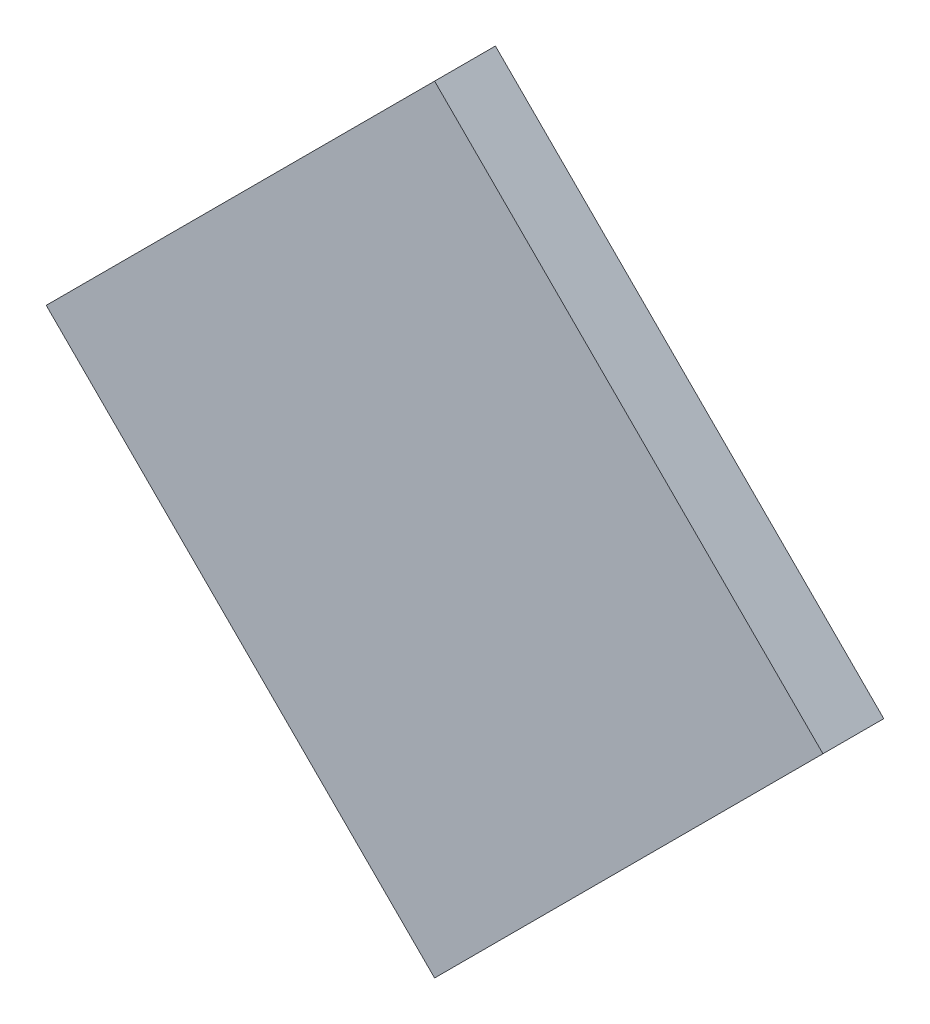
ISO-10303-21;
HEADER;
FILE_DESCRIPTION(('STEP AP214'),'2;1');
FILE_NAME('part.step','',(''),(''),'','','');
FILE_SCHEMA(('AUTOMOTIVE_DESIGN { 1 0 10303 214 1 1 1 1 }'));
ENDSEC;
DATA;
#1=APPLICATION_CONTEXT('core data for automotive mechanical design processes');
#2=APPLICATION_PROTOCOL_DEFINITION('international standard','automotive_design',2000,#1);
#3=PRODUCT_CONTEXT('',#1,'mechanical');
#4=PRODUCT('Part','Part','',(#3));
#5=PRODUCT_RELATED_PRODUCT_CATEGORY('part','',(#4));
#6=PRODUCT_DEFINITION_FORMATION('','',#4);
#7=PRODUCT_DEFINITION_CONTEXT('part definition',#1,'design');
#8=PRODUCT_DEFINITION('design','',#6,#7);
#9=PRODUCT_DEFINITION_SHAPE('','',#8);
#10=(LENGTH_UNIT() NAMED_UNIT(*) SI_UNIT(.MILLI.,.METRE.));
#11=(NAMED_UNIT(*) PLANE_ANGLE_UNIT() SI_UNIT($,.RADIAN.));
#12=(NAMED_UNIT(*) SI_UNIT($,.STERADIAN.) SOLID_ANGLE_UNIT());
#13=UNCERTAINTY_MEASURE_WITH_UNIT(LENGTH_MEASURE(1.E-05),#10,'distance_accuracy_value','');
#14=(GEOMETRIC_REPRESENTATION_CONTEXT(3) GLOBAL_UNCERTAINTY_ASSIGNED_CONTEXT((#13)) GLOBAL_UNIT_ASSIGNED_CONTEXT((#10,
#11,#12)) REPRESENTATION_CONTEXT('',''));
#15=CARTESIAN_POINT('',(0.,0.,0.));
#16=DIRECTION('',(0.,0.,1.));
#17=DIRECTION('',(1.,0.,0.));
#18=AXIS2_PLACEMENT_3D('',#15,#16,#17);
#19=CARTESIAN_POINT('',(-5.079999993995E-06,9.89949252,1.54999944));
#20=DIRECTION('',(0.,0.,-1.));
#21=DIRECTION('',(-1.,0.,0.));
#22=AXIS2_PLACEMENT_3D('',#19,#20,#21);
#23=PLANE('',#22);
#24=DIRECTION('',(-0.707107144043954,0.707106418328954,0.));
#25=VECTOR('',#24,1.);
#26=CARTESIAN_POINT('',(-9.89949252,-5.080000001101E-06,1.54999944));
#27=LINE('',#26,#25);
#28=CARTESIAN_POINT('',(-9.89949251999906,-5.08000094196808E-06,1.54999944));
#29=VERTEX_POINT('',#28);
#30=CARTESIAN_POINT('',(5.08000095827439E-06,-9.89949251999907,1.54999944));
#31=VERTEX_POINT('',#30);
#32=EDGE_CURVE('E55',#29,#31,#27,.F.);
#33=ORIENTED_EDGE('',*,*,#32,.T.);
#34=DIRECTION('',(-0.707106418328954,-0.707107144043954,0.));
#35=VECTOR('',#34,1.);
#36=CARTESIAN_POINT('',(5.080000022417E-06,-9.89949252,1.54999944));
#37=LINE('',#36,#35);
#38=CARTESIAN_POINT('',(9.89949251999906,5.08000093828179E-06,1.54999944));
#39=VERTEX_POINT('',#38);
#40=EDGE_CURVE('E57',#31,#39,#37,.F.);
#41=ORIENTED_EDGE('',*,*,#40,.T.);
#42=DIRECTION('',(0.707107144043954,-0.707106418328954,0.));
#43=VECTOR('',#42,1.);
#44=CARTESIAN_POINT('',(9.89949252,5.080000001101E-06,1.54999944));
#45=LINE('',#44,#43);
#46=CARTESIAN_POINT('',(-5.08000187482584E-06,9.89949251999812,1.54999944));
#47=VERTEX_POINT('',#46);
#48=EDGE_CURVE('E20',#39,#47,#45,.F.);
#49=ORIENTED_EDGE('',*,*,#48,.T.);
#50=DIRECTION('',(0.707106418328954,0.707107144043954,0.));
#51=VECTOR('',#50,1.);
#52=CARTESIAN_POINT('',(-5.079999993995E-06,9.89949252,1.54999944));
#53=LINE('',#52,#51);
#54=EDGE_CURVE('E80',#47,#29,#53,.F.);
#55=ORIENTED_EDGE('',*,*,#54,.T.);
#56=EDGE_LOOP('',(#33,#41,#49,#55));
#57=FACE_BOUND('',#56,.T.);
#58=ADVANCED_FACE('F17',(#57),#23,.F.);
#59=CARTESIAN_POINT('',(9.89949252,5.080000001101E-06,0.));
#60=DIRECTION('',(-0.707106418328954,-0.707107144043954,0.));
#61=DIRECTION('',(0.707107144043954,-0.707106418328954,0.));
#62=AXIS2_PLACEMENT_3D('',#59,#60,#61);
#63=PLANE('',#62);
#64=DIRECTION('',(0.,0.,1.));
#65=VECTOR('',#64,1.);
#66=CARTESIAN_POINT('',(-5.079999993995E-06,9.89949252,0.));
#67=LINE('',#66,#65);
#68=CARTESIAN_POINT('',(-5.08000187612688E-06,9.89949251999812,0.));
#69=VERTEX_POINT('',#68);
#70=EDGE_CURVE('E68',#69,#47,#67,.T.);
#71=ORIENTED_EDGE('',*,*,#70,.T.);
#72=ORIENTED_EDGE('',*,*,#48,.F.);
#73=DIRECTION('',(0.,0.,1.));
#74=VECTOR('',#73,1.);
#75=CARTESIAN_POINT('',(9.89949251999626,5.08000375099016E-06,0.));
#76=LINE('',#75,#74);
#77=CARTESIAN_POINT('',(9.89949251999906,5.08000093886122E-06,0.));
#78=VERTEX_POINT('',#77);
#79=EDGE_CURVE('E63',#39,#78,#76,.F.);
#80=ORIENTED_EDGE('',*,*,#79,.T.);
#81=DIRECTION('',(0.707107144043686,-0.707106418329223,0.));
#82=VECTOR('',#81,1.);
#83=CARTESIAN_POINT('',(-5.079999993995E-06,9.89949252,0.));
#84=LINE('',#83,#82);
#85=EDGE_CURVE('E83',#69,#78,#84,.T.);
#86=ORIENTED_EDGE('',*,*,#85,.F.);
#87=EDGE_LOOP('',(#71,#72,#80,#86));
#88=FACE_BOUND('',#87,.T.);
#89=ADVANCED_FACE('F65',(#88),#63,.F.);
#90=CARTESIAN_POINT('',(5.080000022417E-06,-9.89949252,0.));
#91=DIRECTION('',(-0.707107144043954,0.707106418328954,0.));
#92=DIRECTION('',(-0.707106418328954,-0.707107144043954,0.));
#93=AXIS2_PLACEMENT_3D('',#90,#91,#92);
#94=PLANE('',#93);
#95=ORIENTED_EDGE('',*,*,#79,.F.);
#96=ORIENTED_EDGE('',*,*,#40,.F.);
#97=DIRECTION('',(0.,0.,1.));
#98=VECTOR('',#97,1.);
#99=CARTESIAN_POINT('',(5.08000377180684E-06,-9.89949251999625,0.));
#100=LINE('',#99,#98);
#101=CARTESIAN_POINT('',(5.08000095945311E-06,-9.89949251999906,0.));
#102=VERTEX_POINT('',#101);
#103=EDGE_CURVE('E75',#31,#102,#100,.F.);
#104=ORIENTED_EDGE('',*,*,#103,.T.);
#105=DIRECTION('',(-0.707106418329222,-0.707107144043687,0.));
#106=VECTOR('',#105,1.);
#107=CARTESIAN_POINT('',(9.89949252,5.080000000518E-06,0.));
#108=LINE('',#107,#106);
#109=EDGE_CURVE('E72',#78,#102,#108,.T.);
#110=ORIENTED_EDGE('',*,*,#109,.F.);
#111=EDGE_LOOP('',(#95,#96,#104,#110));
#112=FACE_BOUND('',#111,.T.);
#113=ADVANCED_FACE('F70',(#112),#94,.F.);
#114=CARTESIAN_POINT('',(-9.89949252,-5.080000001101E-06,0.));
#115=DIRECTION('',(0.707106418328954,0.707107144043954,0.));
#116=DIRECTION('',(-0.707107144043954,0.707106418328954,0.));
#117=AXIS2_PLACEMENT_3D('',#114,#115,#116);
#118=PLANE('',#117);
#119=ORIENTED_EDGE('',*,*,#103,.F.);
#120=ORIENTED_EDGE('',*,*,#32,.F.);
#121=DIRECTION('',(0.,0.,1.));
#122=VECTOR('',#121,1.);
#123=CARTESIAN_POINT('',(-9.89949251999624,-5.08000376486795E-06,0.));
#124=LINE('',#123,#122);
#125=CARTESIAN_POINT('',(-9.89949251999906,-5.08000094233067E-06,0.));
#126=VERTEX_POINT('',#125);
#127=EDGE_CURVE('E35',#29,#126,#124,.F.);
#128=ORIENTED_EDGE('',*,*,#127,.T.);
#129=DIRECTION('',(-0.707107144043687,0.707106418329222,0.));
#130=VECTOR('',#129,1.);
#131=CARTESIAN_POINT('',(5.080000022417E-06,-9.89949252,0.));
#132=LINE('',#131,#130);
#133=EDGE_CURVE('E26',#102,#126,#132,.T.);
#134=ORIENTED_EDGE('',*,*,#133,.F.);
#135=EDGE_LOOP('',(#119,#120,#128,#134));
#136=FACE_BOUND('',#135,.T.);
#137=ADVANCED_FACE('F89',(#136),#118,.F.);
#138=CARTESIAN_POINT('',(-5.079999993995E-06,9.89949252,0.));
#139=DIRECTION('',(0.707107144043954,-0.707106418328954,0.));
#140=DIRECTION('',(0.707106418328954,0.707107144043954,0.));
#141=AXIS2_PLACEMENT_3D('',#138,#139,#140);
#142=PLANE('',#141);
#143=ORIENTED_EDGE('',*,*,#127,.F.);
#144=ORIENTED_EDGE('',*,*,#54,.F.);
#145=ORIENTED_EDGE('',*,*,#70,.F.);
#146=DIRECTION('',(0.707106418329223,0.707107144043686,0.));
#147=VECTOR('',#146,1.);
#148=CARTESIAN_POINT('',(-9.89949252,-5.080000000518E-06,0.));
#149=LINE('',#148,#147);
#150=EDGE_CURVE('E11',#126,#69,#149,.T.);
#151=ORIENTED_EDGE('',*,*,#150,.F.);
#152=EDGE_LOOP('',(#143,#144,#145,#151));
#153=FACE_BOUND('',#152,.T.);
#154=ADVANCED_FACE('F91',(#153),#142,.F.);
#155=CARTESIAN_POINT('',(-5.079999993995E-06,9.89949252,0.));
#156=DIRECTION('',(0.,0.,-1.));
#157=DIRECTION('',(-1.,0.,0.));
#158=AXIS2_PLACEMENT_3D('',#155,#156,#157);
#159=PLANE('',#158);
#160=ORIENTED_EDGE('',*,*,#133,.T.);
#161=ORIENTED_EDGE('',*,*,#150,.T.);
#162=ORIENTED_EDGE('',*,*,#85,.T.);
#163=ORIENTED_EDGE('',*,*,#109,.T.);
#164=EDGE_LOOP('',(#160,#161,#162,#163));
#165=FACE_BOUND('',#164,.T.);
#166=ADVANCED_FACE('F88',(#165),#159,.T.);
#167=CLOSED_SHELL('',(#58,#89,#113,#137,#154,#166));
#168=MANIFOLD_SOLID_BREP('B1',#167);
#169=ADVANCED_BREP_SHAPE_REPRESENTATION('',(#18,#168),#14);
#170=SHAPE_DEFINITION_REPRESENTATION(#9,#169);
ENDSEC;
END-ISO-10303-21;
